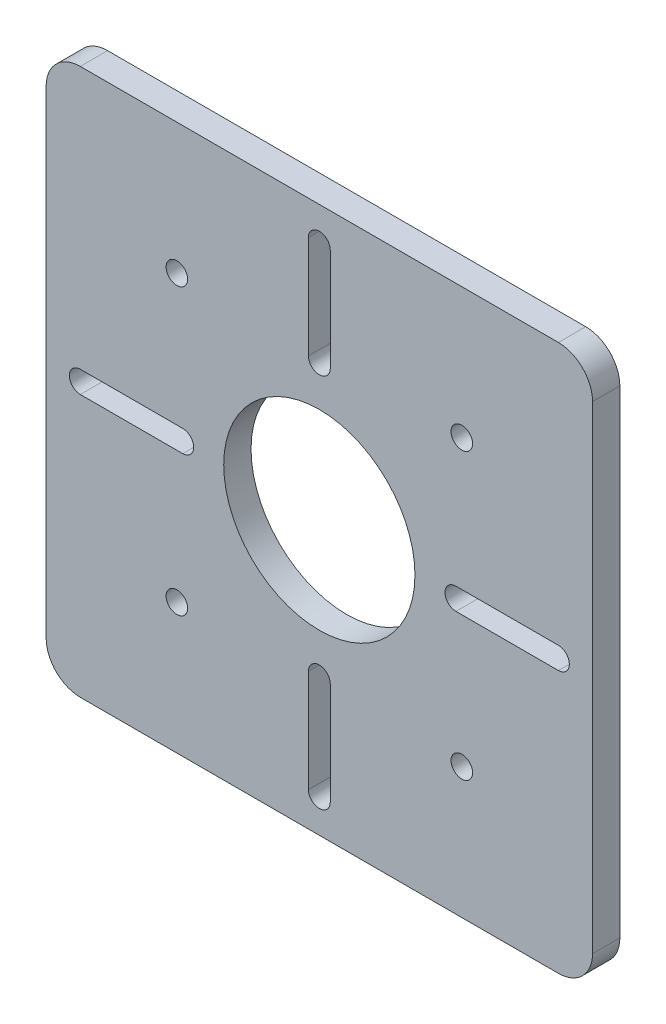
ISO-10303-21;
HEADER;
FILE_DESCRIPTION(('STEP AP214'),'2;1');
FILE_NAME('part.step','',(''),(''),'','','');
FILE_SCHEMA(('AUTOMOTIVE_DESIGN { 1 0 10303 214 1 1 1 1 }'));
ENDSEC;
DATA;
#1=APPLICATION_CONTEXT('core data for automotive mechanical design processes');
#2=APPLICATION_PROTOCOL_DEFINITION('international standard','automotive_design',2000,#1);
#3=PRODUCT_CONTEXT('',#1,'mechanical');
#4=PRODUCT('Part','Part','',(#3));
#5=PRODUCT_RELATED_PRODUCT_CATEGORY('part','',(#4));
#6=PRODUCT_DEFINITION_FORMATION('','',#4);
#7=PRODUCT_DEFINITION_CONTEXT('part definition',#1,'design');
#8=PRODUCT_DEFINITION('design','',#6,#7);
#9=PRODUCT_DEFINITION_SHAPE('','',#8);
#10=(LENGTH_UNIT() NAMED_UNIT(*) SI_UNIT(.MILLI.,.METRE.));
#11=(NAMED_UNIT(*) PLANE_ANGLE_UNIT() SI_UNIT($,.RADIAN.));
#12=(NAMED_UNIT(*) SI_UNIT($,.STERADIAN.) SOLID_ANGLE_UNIT());
#13=UNCERTAINTY_MEASURE_WITH_UNIT(LENGTH_MEASURE(1.E-05),#10,'distance_accuracy_value','');
#14=(GEOMETRIC_REPRESENTATION_CONTEXT(3) GLOBAL_UNCERTAINTY_ASSIGNED_CONTEXT((#13)) GLOBAL_UNIT_ASSIGNED_CONTEXT((#10,
#11,#12)) REPRESENTATION_CONTEXT('',''));
#15=CARTESIAN_POINT('',(0.,0.,0.));
#16=DIRECTION('',(0.,0.,1.));
#17=DIRECTION('',(1.,0.,0.));
#18=AXIS2_PLACEMENT_3D('',#15,#16,#17);
#19=CARTESIAN_POINT('',(0.,0.,4.));
#20=DIRECTION('',(0.,0.,-1.));
#21=DIRECTION('',(-1.,0.,0.));
#22=AXIS2_PLACEMENT_3D('',#19,#20,#21);
#23=PLANE('',#22);
#24=CARTESIAN_POINT('',(0.,0.,4.));
#25=DIRECTION('',(0.,0.,1.));
#26=DIRECTION('',(1.,0.,0.));
#27=AXIS2_PLACEMENT_3D('',#24,#25,#26);
#28=CIRCLE('',#27,14.);
#29=CARTESIAN_POINT('',(14.,0.,4.));
#30=VERTEX_POINT('',#29);
#31=EDGE_CURVE('E249',#30,#30,#28,.T.);
#32=ORIENTED_EDGE('',*,*,#31,.F.);
#33=EDGE_LOOP('',(#32));
#34=FACE_BOUND('',#33,.T.);
#35=CARTESIAN_POINT('',(35.0000000000001,-7.54604712049911E-13,4.));
#36=DIRECTION('',(0.,0.,1.));
#37=DIRECTION('',(1.,0.,0.));
#38=AXIS2_PLACEMENT_3D('',#35,#36,#37);
#39=CIRCLE('',#38,1.59999999999997);
#40=CARTESIAN_POINT('',(35.,-1.60000000000071,4.));
#41=VERTEX_POINT('',#40);
#42=CARTESIAN_POINT('',(35.0000000000001,1.59999999999924,4.));
#43=VERTEX_POINT('',#42);
#44=EDGE_CURVE('E255',#41,#43,#39,.T.);
#45=ORIENTED_EDGE('',*,*,#44,.F.);
#46=DIRECTION('',(1.,0.,0.));
#47=VECTOR('',#46,1.);
#48=CARTESIAN_POINT('',(20.,-1.60000000000042,4.));
#49=LINE('',#48,#47);
#50=CARTESIAN_POINT('',(20.,-1.60000000000042,4.));
#51=VERTEX_POINT('',#50);
#52=EDGE_CURVE('E263',#51,#41,#49,.T.);
#53=ORIENTED_EDGE('',*,*,#52,.F.);
#54=CARTESIAN_POINT('',(20.,-4.40619762898109E-13,4.));
#55=DIRECTION('',(0.,0.,1.));
#56=DIRECTION('',(1.,0.,0.));
#57=AXIS2_PLACEMENT_3D('',#54,#55,#56);
#58=CIRCLE('',#57,1.59999999999997);
#59=CARTESIAN_POINT('',(20.,1.59999999999953,4.));
#60=VERTEX_POINT('',#59);
#61=EDGE_CURVE('E260',#60,#51,#58,.T.);
#62=ORIENTED_EDGE('',*,*,#61,.F.);
#63=DIRECTION('',(-1.,0.,0.));
#64=VECTOR('',#63,1.);
#65=CARTESIAN_POINT('',(35.0000000000001,1.59999999999924,4.));
#66=LINE('',#65,#64);
#67=EDGE_CURVE('E257',#43,#60,#66,.T.);
#68=ORIENTED_EDGE('',*,*,#67,.F.);
#69=EDGE_LOOP('',(#45,#53,#62,#68));
#70=FACE_BOUND('',#69,.T.);
#71=CARTESIAN_POINT('',(6.80011602582908E-13,35.,4.));
#72=DIRECTION('',(0.,0.,1.));
#73=DIRECTION('',(1.,0.,0.));
#74=AXIS2_PLACEMENT_3D('',#71,#72,#73);
#75=CIRCLE('',#74,1.6);
#76=CARTESIAN_POINT('',(1.60000000000068,35.,4.));
#77=VERTEX_POINT('',#76);
#78=CARTESIAN_POINT('',(-1.59999999999932,35.,4.));
#79=VERTEX_POINT('',#78);
#80=EDGE_CURVE('E318',#77,#79,#75,.T.);
#81=ORIENTED_EDGE('',*,*,#80,.F.);
#82=DIRECTION('',(0.,1.,0.));
#83=VECTOR('',#82,1.);
#84=CARTESIAN_POINT('',(1.60000000000041,20.,4.));
#85=LINE('',#84,#83);
#86=CARTESIAN_POINT('',(1.60000000000041,20.,4.));
#87=VERTEX_POINT('',#86);
#88=EDGE_CURVE('E326',#87,#77,#85,.T.);
#89=ORIENTED_EDGE('',*,*,#88,.F.);
#90=CARTESIAN_POINT('',(4.02455846426619E-13,20.,4.));
#91=DIRECTION('',(0.,0.,1.));
#92=DIRECTION('',(1.,0.,0.));
#93=AXIS2_PLACEMENT_3D('',#90,#91,#92);
#94=CIRCLE('',#93,1.6);
#95=CARTESIAN_POINT('',(-1.5999999999996,20.,4.));
#96=VERTEX_POINT('',#95);
#97=EDGE_CURVE('E323',#96,#87,#94,.T.);
#98=ORIENTED_EDGE('',*,*,#97,.F.);
#99=DIRECTION('',(0.,-1.,0.));
#100=VECTOR('',#99,1.);
#101=CARTESIAN_POINT('',(-1.59999999999932,35.,4.));
#102=LINE('',#101,#100);
#103=EDGE_CURVE('E320',#79,#96,#102,.T.);
#104=ORIENTED_EDGE('',*,*,#103,.F.);
#105=EDGE_LOOP('',(#81,#89,#98,#104));
#106=FACE_BOUND('',#105,.T.);
#107=DIRECTION('',(-1.,0.,0.));
#108=VECTOR('',#107,1.);
#109=CARTESIAN_POINT('',(-40.,40.,4.));
#110=LINE('',#109,#108);
#111=CARTESIAN_POINT('',(35.,40.,4.));
#112=VERTEX_POINT('',#111);
#113=CARTESIAN_POINT('',(-35.,40.,4.));
#114=VERTEX_POINT('',#113);
#115=EDGE_CURVE('E350',#112,#114,#110,.T.);
#116=ORIENTED_EDGE('',*,*,#115,.T.);
#117=CARTESIAN_POINT('',(-35.,35.,4.));
#118=DIRECTION('',(0.,0.,-1.));
#119=DIRECTION('',(-1.,0.,0.));
#120=AXIS2_PLACEMENT_3D('',#117,#118,#119);
#121=CIRCLE('',#120,5.);
#122=CARTESIAN_POINT('',(-40.,35.,4.));
#123=VERTEX_POINT('',#122);
#124=EDGE_CURVE('E390',#114,#123,#121,.F.);
#125=ORIENTED_EDGE('',*,*,#124,.T.);
#126=DIRECTION('',(0.,-1.,0.));
#127=VECTOR('',#126,1.);
#128=CARTESIAN_POINT('',(-40.,-40.,4.));
#129=LINE('',#128,#127);
#130=CARTESIAN_POINT('',(-40.,-35.,4.));
#131=VERTEX_POINT('',#130);
#132=EDGE_CURVE('E354',#123,#131,#129,.T.);
#133=ORIENTED_EDGE('',*,*,#132,.T.);
#134=CARTESIAN_POINT('',(-35.,-35.,4.));
#135=DIRECTION('',(0.,0.,-1.));
#136=DIRECTION('',(-1.,0.,0.));
#137=AXIS2_PLACEMENT_3D('',#134,#135,#136);
#138=CIRCLE('',#137,5.);
#139=CARTESIAN_POINT('',(-35.,-40.,4.));
#140=VERTEX_POINT('',#139);
#141=EDGE_CURVE('E63',#131,#140,#138,.F.);
#142=ORIENTED_EDGE('',*,*,#141,.T.);
#143=DIRECTION('',(1.,0.,0.));
#144=VECTOR('',#143,1.);
#145=CARTESIAN_POINT('',(-40.,-40.,4.));
#146=LINE('',#145,#144);
#147=CARTESIAN_POINT('',(35.,-40.,4.));
#148=VERTEX_POINT('',#147);
#149=EDGE_CURVE('E356',#140,#148,#146,.T.);
#150=ORIENTED_EDGE('',*,*,#149,.T.);
#151=CARTESIAN_POINT('',(35.,-35.,4.));
#152=DIRECTION('',(0.,0.,-1.));
#153=DIRECTION('',(-1.,0.,0.));
#154=AXIS2_PLACEMENT_3D('',#151,#152,#153);
#155=CIRCLE('',#154,5.);
#156=CARTESIAN_POINT('',(40.,-35.,4.));
#157=VERTEX_POINT('',#156);
#158=EDGE_CURVE('E386',#148,#157,#155,.F.);
#159=ORIENTED_EDGE('',*,*,#158,.T.);
#160=DIRECTION('',(0.,1.,0.));
#161=VECTOR('',#160,1.);
#162=CARTESIAN_POINT('',(40.,-40.,4.));
#163=LINE('',#162,#161);
#164=CARTESIAN_POINT('',(40.,35.,4.));
#165=VERTEX_POINT('',#164);
#166=EDGE_CURVE('E347',#157,#165,#163,.T.);
#167=ORIENTED_EDGE('',*,*,#166,.T.);
#168=CARTESIAN_POINT('',(35.,35.,4.));
#169=DIRECTION('',(0.,0.,-1.));
#170=DIRECTION('',(-1.,0.,0.));
#171=AXIS2_PLACEMENT_3D('',#168,#169,#170);
#172=CIRCLE('',#171,5.);
#173=EDGE_CURVE('E388',#165,#112,#172,.F.);
#174=ORIENTED_EDGE('',*,*,#173,.T.);
#175=EDGE_LOOP('',(#116,#125,#133,#142,#150,#159,#167,#174));
#176=FACE_BOUND('',#175,.T.);
#177=CARTESIAN_POINT('',(-7.7715611723761E-13,-35.0000000000001,4.));
#178=DIRECTION('',(0.,0.,1.));
#179=DIRECTION('',(1.,0.,0.));
#180=AXIS2_PLACEMENT_3D('',#177,#178,#179);
#181=CIRCLE('',#180,1.6);
#182=CARTESIAN_POINT('',(-1.60000000000078,-35.,4.));
#183=VERTEX_POINT('',#182);
#184=CARTESIAN_POINT('',(1.59999999999923,-35.0000000000001,4.));
#185=VERTEX_POINT('',#184);
#186=EDGE_CURVE('E286',#183,#185,#181,.T.);
#187=ORIENTED_EDGE('',*,*,#186,.F.);
#188=DIRECTION('',(0.,-1.,0.));
#189=VECTOR('',#188,1.);
#190=CARTESIAN_POINT('',(-1.60000000000039,-20.,4.));
#191=LINE('',#190,#189);
#192=CARTESIAN_POINT('',(-1.60000000000039,-20.,4.));
#193=VERTEX_POINT('',#192);
#194=EDGE_CURVE('E294',#193,#183,#191,.T.);
#195=ORIENTED_EDGE('',*,*,#194,.F.);
#196=CARTESIAN_POINT('',(-4.85722573273506E-13,-20.,4.));
#197=DIRECTION('',(0.,0.,1.));
#198=DIRECTION('',(1.,0.,0.));
#199=AXIS2_PLACEMENT_3D('',#196,#197,#198);
#200=CIRCLE('',#199,1.59999999999998);
#201=CARTESIAN_POINT('',(1.59999999999949,-20.0000000000001,4.));
#202=VERTEX_POINT('',#201);
#203=EDGE_CURVE('E291',#202,#193,#200,.T.);
#204=ORIENTED_EDGE('',*,*,#203,.F.);
#205=DIRECTION('',(0.,1.,0.));
#206=VECTOR('',#205,1.);
#207=CARTESIAN_POINT('',(1.59999999999923,-35.0000000000001,4.));
#208=LINE('',#207,#206);
#209=EDGE_CURVE('E288',#185,#202,#208,.T.);
#210=ORIENTED_EDGE('',*,*,#209,.F.);
#211=EDGE_LOOP('',(#187,#195,#204,#210));
#212=FACE_BOUND('',#211,.T.);
#213=CARTESIAN_POINT('',(-19.9999999999999,0.,4.));
#214=DIRECTION('',(0.,0.,1.));
#215=DIRECTION('',(1.,0.,0.));
#216=AXIS2_PLACEMENT_3D('',#213,#214,#215);
#217=CIRCLE('',#216,1.59999999999998);
#218=CARTESIAN_POINT('',(-20.,-1.59999999999999,4.));
#219=VERTEX_POINT('',#218);
#220=CARTESIAN_POINT('',(-19.9999999999999,1.59999999999997,4.));
#221=VERTEX_POINT('',#220);
#222=EDGE_CURVE('E205',#219,#221,#217,.T.);
#223=ORIENTED_EDGE('',*,*,#222,.F.);
#224=DIRECTION('',(1.,0.,0.));
#225=VECTOR('',#224,1.);
#226=CARTESIAN_POINT('',(-35.,-1.59999999999999,4.));
#227=LINE('',#226,#225);
#228=CARTESIAN_POINT('',(-35.,-1.59999999999999,4.));
#229=VERTEX_POINT('',#228);
#230=EDGE_CURVE('E231',#229,#219,#227,.T.);
#231=ORIENTED_EDGE('',*,*,#230,.F.);
#232=CARTESIAN_POINT('',(-35.,0.,4.));
#233=DIRECTION('',(0.,0.,1.));
#234=DIRECTION('',(1.,0.,0.));
#235=AXIS2_PLACEMENT_3D('',#232,#233,#234);
#236=CIRCLE('',#235,1.59999999999998);
#237=CARTESIAN_POINT('',(-35.,1.59999999999997,4.));
#238=VERTEX_POINT('',#237);
#239=EDGE_CURVE('E229',#238,#229,#236,.T.);
#240=ORIENTED_EDGE('',*,*,#239,.F.);
#241=DIRECTION('',(-1.,0.,0.));
#242=VECTOR('',#241,1.);
#243=CARTESIAN_POINT('',(-19.9999999999999,1.59999999999997,4.));
#244=LINE('',#243,#242);
#245=EDGE_CURVE('E215',#221,#238,#244,.T.);
#246=ORIENTED_EDGE('',*,*,#245,.F.);
#247=EDGE_LOOP('',(#223,#231,#240,#246));
#248=FACE_BOUND('',#247,.T.);
#249=CARTESIAN_POINT('',(-20.8596500450031,-20.8596500450031,4.));
#250=DIRECTION('',(0.,0.,1.));
#251=DIRECTION('',(1.,0.,0.));
#252=AXIS2_PLACEMENT_3D('',#249,#250,#251);
#253=CIRCLE('',#252,1.575);
#254=CARTESIAN_POINT('',(-19.2846500450032,-20.8596500450031,4.));
#255=VERTEX_POINT('',#254);
#256=EDGE_CURVE('E238',#255,#255,#253,.T.);
#257=ORIENTED_EDGE('',*,*,#256,.F.);
#258=EDGE_LOOP('',(#257));
#259=FACE_BOUND('',#258,.T.);
#260=CARTESIAN_POINT('',(-20.8596500450031,20.8596500450032,4.));
#261=DIRECTION('',(0.,0.,1.));
#262=DIRECTION('',(1.,0.,0.));
#263=AXIS2_PLACEMENT_3D('',#260,#261,#262);
#264=CIRCLE('',#263,1.575);
#265=CARTESIAN_POINT('',(-19.2846500450031,20.8596500450032,4.));
#266=VERTEX_POINT('',#265);
#267=EDGE_CURVE('E785',#266,#266,#264,.T.);
#268=ORIENTED_EDGE('',*,*,#267,.F.);
#269=EDGE_LOOP('',(#268));
#270=FACE_BOUND('',#269,.T.);
#271=CARTESIAN_POINT('',(20.8596500450033,20.859650045003,4.));
#272=DIRECTION('',(0.,0.,1.));
#273=DIRECTION('',(1.,0.,0.));
#274=AXIS2_PLACEMENT_3D('',#271,#272,#273);
#275=CIRCLE('',#274,1.575);
#276=CARTESIAN_POINT('',(22.4346500450033,20.859650045003,4.));
#277=VERTEX_POINT('',#276);
#278=EDGE_CURVE('E780',#277,#277,#275,.T.);
#279=ORIENTED_EDGE('',*,*,#278,.F.);
#280=EDGE_LOOP('',(#279));
#281=FACE_BOUND('',#280,.T.);
#282=CARTESIAN_POINT('',(20.8596500450029,-20.8596500450034,4.));
#283=DIRECTION('',(0.,0.,1.));
#284=DIRECTION('',(1.,0.,0.));
#285=AXIS2_PLACEMENT_3D('',#282,#283,#284);
#286=CIRCLE('',#285,1.575);
#287=CARTESIAN_POINT('',(22.4346500450029,-20.8596500450034,4.));
#288=VERTEX_POINT('',#287);
#289=EDGE_CURVE('E774',#288,#288,#286,.T.);
#290=ORIENTED_EDGE('',*,*,#289,.F.);
#291=EDGE_LOOP('',(#290));
#292=FACE_BOUND('',#291,.T.);
#293=ADVANCED_FACE('F43',(#34,#70,#106,#176,#212,#248,#259,#270,#281,#292),#23,.F.);
#294=CARTESIAN_POINT('',(0.,0.,0.));
#295=DIRECTION('',(0.,0.,-1.));
#296=DIRECTION('',(-1.,0.,0.));
#297=AXIS2_PLACEMENT_3D('',#294,#295,#296);
#298=PLANE('',#297);
#299=CARTESIAN_POINT('',(20.8596500450033,20.859650045003,0.));
#300=DIRECTION('',(0.,0.,1.));
#301=DIRECTION('',(1.,0.,0.));
#302=AXIS2_PLACEMENT_3D('',#299,#300,#301);
#303=CIRCLE('',#302,1.575);
#304=CARTESIAN_POINT('',(22.4346500450033,20.859650045003,0.));
#305=VERTEX_POINT('',#304);
#306=EDGE_CURVE('E777',#305,#305,#303,.T.);
#307=ORIENTED_EDGE('',*,*,#306,.T.);
#308=EDGE_LOOP('',(#307));
#309=FACE_BOUND('',#308,.T.);
#310=CARTESIAN_POINT('',(-20.8596500450031,-20.8596500450031,0.));
#311=DIRECTION('',(0.,0.,1.));
#312=DIRECTION('',(1.,0.,0.));
#313=AXIS2_PLACEMENT_3D('',#310,#311,#312);
#314=CIRCLE('',#313,1.575);
#315=CARTESIAN_POINT('',(-19.2846500450032,-20.8596500450031,0.));
#316=VERTEX_POINT('',#315);
#317=EDGE_CURVE('E788',#316,#316,#314,.T.);
#318=ORIENTED_EDGE('',*,*,#317,.T.);
#319=EDGE_LOOP('',(#318));
#320=FACE_BOUND('',#319,.T.);
#321=DIRECTION('',(1.,0.,0.));
#322=VECTOR('',#321,1.);
#323=CARTESIAN_POINT('',(20.,-1.60000000000042,0.));
#324=LINE('',#323,#322);
#325=CARTESIAN_POINT('',(20.,-1.60000000000042,0.));
#326=VERTEX_POINT('',#325);
#327=CARTESIAN_POINT('',(35.,-1.60000000000071,0.));
#328=VERTEX_POINT('',#327);
#329=EDGE_CURVE('E258',#326,#328,#324,.T.);
#330=ORIENTED_EDGE('',*,*,#329,.T.);
#331=CARTESIAN_POINT('',(35.0000000000001,-7.54604712049911E-13,0.));
#332=DIRECTION('',(0.,0.,1.));
#333=DIRECTION('',(1.,0.,0.));
#334=AXIS2_PLACEMENT_3D('',#331,#332,#333);
#335=CIRCLE('',#334,1.59999999999997);
#336=CARTESIAN_POINT('',(35.0000000000001,1.59999999999924,0.));
#337=VERTEX_POINT('',#336);
#338=EDGE_CURVE('E252',#328,#337,#335,.T.);
#339=ORIENTED_EDGE('',*,*,#338,.T.);
#340=DIRECTION('',(-1.,0.,0.));
#341=VECTOR('',#340,1.);
#342=CARTESIAN_POINT('',(35.0000000000001,1.59999999999924,0.));
#343=LINE('',#342,#341);
#344=CARTESIAN_POINT('',(20.,1.59999999999953,0.));
#345=VERTEX_POINT('',#344);
#346=EDGE_CURVE('E268',#337,#345,#343,.T.);
#347=ORIENTED_EDGE('',*,*,#346,.T.);
#348=CARTESIAN_POINT('',(20.,-4.40619762898109E-13,0.));
#349=DIRECTION('',(0.,0.,1.));
#350=DIRECTION('',(1.,0.,0.));
#351=AXIS2_PLACEMENT_3D('',#348,#349,#350);
#352=CIRCLE('',#351,1.59999999999997);
#353=EDGE_CURVE('E271',#345,#326,#352,.T.);
#354=ORIENTED_EDGE('',*,*,#353,.T.);
#355=EDGE_LOOP('',(#330,#339,#347,#354));
#356=FACE_BOUND('',#355,.T.);
#357=DIRECTION('',(0.,-1.,0.));
#358=VECTOR('',#357,1.);
#359=CARTESIAN_POINT('',(-1.60000000000039,-20.,0.));
#360=LINE('',#359,#358);
#361=CARTESIAN_POINT('',(-1.60000000000039,-20.,0.));
#362=VERTEX_POINT('',#361);
#363=CARTESIAN_POINT('',(-1.60000000000078,-35.,0.));
#364=VERTEX_POINT('',#363);
#365=EDGE_CURVE('E289',#362,#364,#360,.T.);
#366=ORIENTED_EDGE('',*,*,#365,.T.);
#367=CARTESIAN_POINT('',(-7.7715611723761E-13,-35.0000000000001,0.));
#368=DIRECTION('',(0.,0.,1.));
#369=DIRECTION('',(1.,0.,0.));
#370=AXIS2_PLACEMENT_3D('',#367,#368,#369);
#371=CIRCLE('',#370,1.6);
#372=CARTESIAN_POINT('',(1.59999999999923,-35.0000000000001,0.));
#373=VERTEX_POINT('',#372);
#374=EDGE_CURVE('E285',#364,#373,#371,.T.);
#375=ORIENTED_EDGE('',*,*,#374,.T.);
#376=DIRECTION('',(0.,1.,0.));
#377=VECTOR('',#376,1.);
#378=CARTESIAN_POINT('',(1.59999999999923,-35.0000000000001,0.));
#379=LINE('',#378,#377);
#380=CARTESIAN_POINT('',(1.59999999999949,-20.0000000000001,0.));
#381=VERTEX_POINT('',#380);
#382=EDGE_CURVE('E299',#373,#381,#379,.T.);
#383=ORIENTED_EDGE('',*,*,#382,.T.);
#384=CARTESIAN_POINT('',(-4.85722573273506E-13,-20.,0.));
#385=DIRECTION('',(0.,0.,1.));
#386=DIRECTION('',(1.,0.,0.));
#387=AXIS2_PLACEMENT_3D('',#384,#385,#386);
#388=CIRCLE('',#387,1.59999999999993);
#389=EDGE_CURVE('E302',#381,#362,#388,.T.);
#390=ORIENTED_EDGE('',*,*,#389,.T.);
#391=EDGE_LOOP('',(#366,#375,#383,#390));
#392=FACE_BOUND('',#391,.T.);
#393=DIRECTION('',(0.,1.,0.));
#394=VECTOR('',#393,1.);
#395=CARTESIAN_POINT('',(1.60000000000041,20.,0.));
#396=LINE('',#395,#394);
#397=CARTESIAN_POINT('',(1.60000000000041,20.,0.));
#398=VERTEX_POINT('',#397);
#399=CARTESIAN_POINT('',(1.60000000000068,35.,0.));
#400=VERTEX_POINT('',#399);
#401=EDGE_CURVE('E321',#398,#400,#396,.T.);
#402=ORIENTED_EDGE('',*,*,#401,.T.);
#403=CARTESIAN_POINT('',(6.80011602582908E-13,35.,0.));
#404=DIRECTION('',(0.,0.,1.));
#405=DIRECTION('',(1.,0.,0.));
#406=AXIS2_PLACEMENT_3D('',#403,#404,#405);
#407=CIRCLE('',#406,1.6);
#408=CARTESIAN_POINT('',(-1.59999999999932,35.,0.));
#409=VERTEX_POINT('',#408);
#410=EDGE_CURVE('E317',#400,#409,#407,.T.);
#411=ORIENTED_EDGE('',*,*,#410,.T.);
#412=DIRECTION('',(0.,-1.,0.));
#413=VECTOR('',#412,1.);
#414=CARTESIAN_POINT('',(-1.59999999999932,35.,0.));
#415=LINE('',#414,#413);
#416=CARTESIAN_POINT('',(-1.5999999999996,20.,0.));
#417=VERTEX_POINT('',#416);
#418=EDGE_CURVE('E331',#409,#417,#415,.T.);
#419=ORIENTED_EDGE('',*,*,#418,.T.);
#420=CARTESIAN_POINT('',(4.02455846426619E-13,20.,0.));
#421=DIRECTION('',(0.,0.,1.));
#422=DIRECTION('',(1.,0.,0.));
#423=AXIS2_PLACEMENT_3D('',#420,#421,#422);
#424=CIRCLE('',#423,1.6);
#425=EDGE_CURVE('E334',#417,#398,#424,.T.);
#426=ORIENTED_EDGE('',*,*,#425,.T.);
#427=EDGE_LOOP('',(#402,#411,#419,#426));
#428=FACE_BOUND('',#427,.T.);
#429=DIRECTION('',(0.,-1.,0.));
#430=VECTOR('',#429,1.);
#431=CARTESIAN_POINT('',(-40.,-40.,0.));
#432=LINE('',#431,#430);
#433=CARTESIAN_POINT('',(-40.,35.,0.));
#434=VERTEX_POINT('',#433);
#435=CARTESIAN_POINT('',(-40.,-35.,0.));
#436=VERTEX_POINT('',#435);
#437=EDGE_CURVE('E364',#434,#436,#432,.T.);
#438=ORIENTED_EDGE('',*,*,#437,.F.);
#439=CARTESIAN_POINT('',(-35.,35.,0.));
#440=DIRECTION('',(0.,0.,-1.));
#441=DIRECTION('',(-1.,0.,0.));
#442=AXIS2_PLACEMENT_3D('',#439,#440,#441);
#443=CIRCLE('',#442,5.);
#444=CARTESIAN_POINT('',(-35.,40.,0.));
#445=VERTEX_POINT('',#444);
#446=EDGE_CURVE('E378',#434,#445,#443,.T.);
#447=ORIENTED_EDGE('',*,*,#446,.T.);
#448=DIRECTION('',(-1.,0.,0.));
#449=VECTOR('',#448,1.);
#450=CARTESIAN_POINT('',(-40.,40.,0.));
#451=LINE('',#450,#449);
#452=CARTESIAN_POINT('',(35.,40.,0.));
#453=VERTEX_POINT('',#452);
#454=EDGE_CURVE('E361',#453,#445,#451,.T.);
#455=ORIENTED_EDGE('',*,*,#454,.F.);
#456=CARTESIAN_POINT('',(35.,35.,0.));
#457=DIRECTION('',(0.,0.,-1.));
#458=DIRECTION('',(-1.,0.,0.));
#459=AXIS2_PLACEMENT_3D('',#456,#457,#458);
#460=CIRCLE('',#459,5.);
#461=CARTESIAN_POINT('',(40.,35.,0.));
#462=VERTEX_POINT('',#461);
#463=EDGE_CURVE('E376',#453,#462,#460,.T.);
#464=ORIENTED_EDGE('',*,*,#463,.T.);
#465=DIRECTION('',(0.,1.,0.));
#466=VECTOR('',#465,1.);
#467=CARTESIAN_POINT('',(40.,-40.,0.));
#468=LINE('',#467,#466);
#469=CARTESIAN_POINT('',(40.,-35.,0.));
#470=VERTEX_POINT('',#469);
#471=EDGE_CURVE('E346',#470,#462,#468,.T.);
#472=ORIENTED_EDGE('',*,*,#471,.F.);
#473=CARTESIAN_POINT('',(35.,-35.,0.));
#474=DIRECTION('',(0.,0.,-1.));
#475=DIRECTION('',(-1.,0.,0.));
#476=AXIS2_PLACEMENT_3D('',#473,#474,#475);
#477=CIRCLE('',#476,5.);
#478=CARTESIAN_POINT('',(35.,-40.,0.));
#479=VERTEX_POINT('',#478);
#480=EDGE_CURVE('E374',#470,#479,#477,.T.);
#481=ORIENTED_EDGE('',*,*,#480,.T.);
#482=DIRECTION('',(1.,0.,0.));
#483=VECTOR('',#482,1.);
#484=CARTESIAN_POINT('',(-40.,-40.,0.));
#485=LINE('',#484,#483);
#486=CARTESIAN_POINT('',(-35.,-40.,0.));
#487=VERTEX_POINT('',#486);
#488=EDGE_CURVE('E351',#487,#479,#485,.T.);
#489=ORIENTED_EDGE('',*,*,#488,.F.);
#490=CARTESIAN_POINT('',(-35.,-35.,0.));
#491=DIRECTION('',(0.,0.,-1.));
#492=DIRECTION('',(-1.,0.,0.));
#493=AXIS2_PLACEMENT_3D('',#490,#491,#492);
#494=CIRCLE('',#493,5.);
#495=EDGE_CURVE('E372',#487,#436,#494,.T.);
#496=ORIENTED_EDGE('',*,*,#495,.T.);
#497=EDGE_LOOP('',(#438,#447,#455,#464,#472,#481,#489,#496));
#498=FACE_BOUND('',#497,.T.);
#499=CARTESIAN_POINT('',(0.,0.,0.));
#500=DIRECTION('',(0.,0.,1.));
#501=DIRECTION('',(1.,0.,0.));
#502=AXIS2_PLACEMENT_3D('',#499,#500,#501);
#503=CIRCLE('',#502,14.);
#504=CARTESIAN_POINT('',(14.,0.,0.));
#505=VERTEX_POINT('',#504);
#506=EDGE_CURVE('E223',#505,#505,#503,.T.);
#507=ORIENTED_EDGE('',*,*,#506,.T.);
#508=EDGE_LOOP('',(#507));
#509=FACE_BOUND('',#508,.T.);
#510=DIRECTION('',(1.,0.,0.));
#511=VECTOR('',#510,1.);
#512=CARTESIAN_POINT('',(-35.,-1.59999999999999,0.));
#513=LINE('',#512,#511);
#514=CARTESIAN_POINT('',(-35.,-1.59999999999999,0.));
#515=VERTEX_POINT('',#514);
#516=CARTESIAN_POINT('',(-20.,-1.59999999999999,0.));
#517=VERTEX_POINT('',#516);
#518=EDGE_CURVE('E216',#515,#517,#513,.T.);
#519=ORIENTED_EDGE('',*,*,#518,.T.);
#520=CARTESIAN_POINT('',(-19.9999999999999,0.,0.));
#521=DIRECTION('',(0.,0.,1.));
#522=DIRECTION('',(1.,0.,0.));
#523=AXIS2_PLACEMENT_3D('',#520,#521,#522);
#524=CIRCLE('',#523,1.59999999999998);
#525=CARTESIAN_POINT('',(-19.9999999999999,1.59999999999997,0.));
#526=VERTEX_POINT('',#525);
#527=EDGE_CURVE('E236',#517,#526,#524,.T.);
#528=ORIENTED_EDGE('',*,*,#527,.T.);
#529=DIRECTION('',(-1.,0.,0.));
#530=VECTOR('',#529,1.);
#531=CARTESIAN_POINT('',(-19.9999999999999,1.59999999999997,0.));
#532=LINE('',#531,#530);
#533=CARTESIAN_POINT('',(-35.,1.59999999999997,0.));
#534=VERTEX_POINT('',#533);
#535=EDGE_CURVE('E222',#526,#534,#532,.T.);
#536=ORIENTED_EDGE('',*,*,#535,.T.);
#537=CARTESIAN_POINT('',(-35.,0.,0.));
#538=DIRECTION('',(0.,0.,1.));
#539=DIRECTION('',(1.,0.,0.));
#540=AXIS2_PLACEMENT_3D('',#537,#538,#539);
#541=CIRCLE('',#540,1.59999999999998);
#542=EDGE_CURVE('E240',#534,#515,#541,.T.);
#543=ORIENTED_EDGE('',*,*,#542,.T.);
#544=EDGE_LOOP('',(#519,#528,#536,#543));
#545=FACE_BOUND('',#544,.T.);
#546=CARTESIAN_POINT('',(-20.8596500450031,20.8596500450032,0.));
#547=DIRECTION('',(0.,0.,1.));
#548=DIRECTION('',(1.,0.,0.));
#549=AXIS2_PLACEMENT_3D('',#546,#547,#548);
#550=CIRCLE('',#549,1.575);
#551=CARTESIAN_POINT('',(-19.2846500450031,20.8596500450032,0.));
#552=VERTEX_POINT('',#551);
#553=EDGE_CURVE('E769',#552,#552,#550,.T.);
#554=ORIENTED_EDGE('',*,*,#553,.T.);
#555=EDGE_LOOP('',(#554));
#556=FACE_BOUND('',#555,.T.);
#557=CARTESIAN_POINT('',(20.8596500450029,-20.8596500450034,0.));
#558=DIRECTION('',(0.,0.,1.));
#559=DIRECTION('',(1.,0.,0.));
#560=AXIS2_PLACEMENT_3D('',#557,#558,#559);
#561=CIRCLE('',#560,1.575);
#562=CARTESIAN_POINT('',(22.4346500450029,-20.8596500450034,0.));
#563=VERTEX_POINT('',#562);
#564=EDGE_CURVE('E772',#563,#563,#561,.T.);
#565=ORIENTED_EDGE('',*,*,#564,.T.);
#566=EDGE_LOOP('',(#565));
#567=FACE_BOUND('',#566,.T.);
#568=ADVANCED_FACE('F403',(#309,#320,#356,#392,#428,#498,#509,#545,#556,#567),#298,.T.);
#569=CARTESIAN_POINT('',(40.,-40.,4.));
#570=DIRECTION('',(-1.,0.,0.));
#571=DIRECTION('',(0.,0.,1.));
#572=AXIS2_PLACEMENT_3D('',#569,#570,#571);
#573=PLANE('',#572);
#574=ORIENTED_EDGE('',*,*,#471,.T.);
#575=DIRECTION('',(0.,0.,-1.));
#576=VECTOR('',#575,1.);
#577=CARTESIAN_POINT('',(40.,35.,4.));
#578=LINE('',#577,#576);
#579=EDGE_CURVE('E395',#462,#165,#578,.F.);
#580=ORIENTED_EDGE('',*,*,#579,.T.);
#581=ORIENTED_EDGE('',*,*,#166,.F.);
#582=DIRECTION('',(0.,0.,-1.));
#583=VECTOR('',#582,1.);
#584=CARTESIAN_POINT('',(40.,-35.,4.));
#585=LINE('',#584,#583);
#586=EDGE_CURVE('E392',#157,#470,#585,.T.);
#587=ORIENTED_EDGE('',*,*,#586,.T.);
#588=EDGE_LOOP('',(#574,#580,#581,#587));
#589=FACE_BOUND('',#588,.T.);
#590=ADVANCED_FACE('F412',(#589),#573,.F.);
#591=CARTESIAN_POINT('',(-40.,40.,4.));
#592=DIRECTION('',(0.,-1.,0.));
#593=DIRECTION('',(0.,0.,-1.));
#594=AXIS2_PLACEMENT_3D('',#591,#592,#593);
#595=PLANE('',#594);
#596=ORIENTED_EDGE('',*,*,#454,.T.);
#597=DIRECTION('',(0.,0.,-1.));
#598=VECTOR('',#597,1.);
#599=CARTESIAN_POINT('',(-35.,40.,4.));
#600=LINE('',#599,#598);
#601=EDGE_CURVE('E383',#445,#114,#600,.F.);
#602=ORIENTED_EDGE('',*,*,#601,.T.);
#603=ORIENTED_EDGE('',*,*,#115,.F.);
#604=DIRECTION('',(0.,0.,-1.));
#605=VECTOR('',#604,1.);
#606=CARTESIAN_POINT('',(35.,40.,4.));
#607=LINE('',#606,#605);
#608=EDGE_CURVE('E380',#112,#453,#607,.T.);
#609=ORIENTED_EDGE('',*,*,#608,.T.);
#610=EDGE_LOOP('',(#596,#602,#603,#609));
#611=FACE_BOUND('',#610,.T.);
#612=ADVANCED_FACE('F422',(#611),#595,.F.);
#613=CARTESIAN_POINT('',(-40.,-40.,4.));
#614=DIRECTION('',(1.,0.,0.));
#615=DIRECTION('',(0.,0.,-1.));
#616=AXIS2_PLACEMENT_3D('',#613,#614,#615);
#617=PLANE('',#616);
#618=ORIENTED_EDGE('',*,*,#132,.F.);
#619=DIRECTION('',(0.,0.,-1.));
#620=VECTOR('',#619,1.);
#621=CARTESIAN_POINT('',(-40.,35.,4.));
#622=LINE('',#621,#620);
#623=EDGE_CURVE('E369',#123,#434,#622,.T.);
#624=ORIENTED_EDGE('',*,*,#623,.T.);
#625=ORIENTED_EDGE('',*,*,#437,.T.);
#626=DIRECTION('',(0.,0.,-1.));
#627=VECTOR('',#626,1.);
#628=CARTESIAN_POINT('',(-40.,-35.,4.));
#629=LINE('',#628,#627);
#630=EDGE_CURVE('E358',#436,#131,#629,.F.);
#631=ORIENTED_EDGE('',*,*,#630,.T.);
#632=EDGE_LOOP('',(#618,#624,#625,#631));
#633=FACE_BOUND('',#632,.T.);
#634=ADVANCED_FACE('F430',(#633),#617,.F.);
#635=CARTESIAN_POINT('',(-40.,-40.,4.));
#636=DIRECTION('',(0.,1.,0.));
#637=DIRECTION('',(0.,0.,1.));
#638=AXIS2_PLACEMENT_3D('',#635,#636,#637);
#639=PLANE('',#638);
#640=ORIENTED_EDGE('',*,*,#488,.T.);
#641=DIRECTION('',(0.,0.,-1.));
#642=VECTOR('',#641,1.);
#643=CARTESIAN_POINT('',(35.,-40.,4.));
#644=LINE('',#643,#642);
#645=EDGE_CURVE('E11',#479,#148,#644,.F.);
#646=ORIENTED_EDGE('',*,*,#645,.T.);
#647=ORIENTED_EDGE('',*,*,#149,.F.);
#648=DIRECTION('',(0.,0.,-1.));
#649=VECTOR('',#648,1.);
#650=CARTESIAN_POINT('',(-35.,-40.,4.));
#651=LINE('',#650,#649);
#652=EDGE_CURVE('E51',#140,#487,#651,.T.);
#653=ORIENTED_EDGE('',*,*,#652,.T.);
#654=EDGE_LOOP('',(#640,#646,#647,#653));
#655=FACE_BOUND('',#654,.T.);
#656=ADVANCED_FACE('F399',(#655),#639,.F.);
#657=CARTESIAN_POINT('',(6.80011602582908E-13,35.,4.));
#658=DIRECTION('',(0.,0.,-1.));
#659=DIRECTION('',(-1.,0.,0.));
#660=AXIS2_PLACEMENT_3D('',#657,#658,#659);
#661=CYLINDRICAL_SURFACE('',#660,1.6);
#662=ORIENTED_EDGE('',*,*,#410,.F.);
#663=DIRECTION('',(0.,0.,-1.));
#664=VECTOR('',#663,1.);
#665=CARTESIAN_POINT('',(1.60000000000068,35.,4.));
#666=LINE('',#665,#664);
#667=EDGE_CURVE('E328',#77,#400,#666,.T.);
#668=ORIENTED_EDGE('',*,*,#667,.F.);
#669=ORIENTED_EDGE('',*,*,#80,.T.);
#670=DIRECTION('',(0.,0.,-1.));
#671=VECTOR('',#670,1.);
#672=CARTESIAN_POINT('',(-1.59999999999932,35.,4.));
#673=LINE('',#672,#671);
#674=EDGE_CURVE('E344',#79,#409,#673,.T.);
#675=ORIENTED_EDGE('',*,*,#674,.T.);
#676=EDGE_LOOP('',(#662,#668,#669,#675));
#677=FACE_BOUND('',#676,.T.);
#678=ADVANCED_FACE('F448',(#677),#661,.F.);
#679=CARTESIAN_POINT('',(-1.59999999999932,35.,4.));
#680=DIRECTION('',(1.,0.,0.));
#681=DIRECTION('',(0.,1.,0.));
#682=AXIS2_PLACEMENT_3D('',#679,#680,#681);
#683=PLANE('',#682);
#684=ORIENTED_EDGE('',*,*,#418,.F.);
#685=ORIENTED_EDGE('',*,*,#674,.F.);
#686=ORIENTED_EDGE('',*,*,#103,.T.);
#687=DIRECTION('',(0.,0.,-1.));
#688=VECTOR('',#687,1.);
#689=CARTESIAN_POINT('',(-1.5999999999996,20.,4.));
#690=LINE('',#689,#688);
#691=EDGE_CURVE('E342',#96,#417,#690,.T.);
#692=ORIENTED_EDGE('',*,*,#691,.T.);
#693=EDGE_LOOP('',(#684,#685,#686,#692));
#694=FACE_BOUND('',#693,.T.);
#695=ADVANCED_FACE('F649',(#694),#683,.T.);
#696=CARTESIAN_POINT('',(4.02455846426619E-13,20.,4.));
#697=DIRECTION('',(0.,0.,-1.));
#698=DIRECTION('',(-1.,0.,0.));
#699=AXIS2_PLACEMENT_3D('',#696,#697,#698);
#700=CYLINDRICAL_SURFACE('',#699,1.6);
#701=ORIENTED_EDGE('',*,*,#425,.F.);
#702=ORIENTED_EDGE('',*,*,#691,.F.);
#703=ORIENTED_EDGE('',*,*,#97,.T.);
#704=DIRECTION('',(0.,0.,-1.));
#705=VECTOR('',#704,1.);
#706=CARTESIAN_POINT('',(1.60000000000041,20.,4.));
#707=LINE('',#706,#705);
#708=EDGE_CURVE('E340',#87,#398,#707,.T.);
#709=ORIENTED_EDGE('',*,*,#708,.T.);
#710=EDGE_LOOP('',(#701,#702,#703,#709));
#711=FACE_BOUND('',#710,.T.);
#712=ADVANCED_FACE('F640',(#711),#700,.F.);
#713=CARTESIAN_POINT('',(1.60000000000041,20.,4.));
#714=DIRECTION('',(-1.,0.,0.));
#715=DIRECTION('',(0.,-1.,0.));
#716=AXIS2_PLACEMENT_3D('',#713,#714,#715);
#717=PLANE('',#716);
#718=ORIENTED_EDGE('',*,*,#401,.F.);
#719=ORIENTED_EDGE('',*,*,#708,.F.);
#720=ORIENTED_EDGE('',*,*,#88,.T.);
#721=ORIENTED_EDGE('',*,*,#667,.T.);
#722=EDGE_LOOP('',(#718,#719,#720,#721));
#723=FACE_BOUND('',#722,.T.);
#724=ADVANCED_FACE('F631',(#723),#717,.T.);
#725=CARTESIAN_POINT('',(-7.7715611723761E-13,-35.0000000000001,4.));
#726=DIRECTION('',(0.,0.,-1.));
#727=DIRECTION('',(-1.,0.,0.));
#728=AXIS2_PLACEMENT_3D('',#725,#726,#727);
#729=CYLINDRICAL_SURFACE('',#728,1.6);
#730=ORIENTED_EDGE('',*,*,#374,.F.);
#731=DIRECTION('',(0.,0.,-1.));
#732=VECTOR('',#731,1.);
#733=CARTESIAN_POINT('',(-1.60000000000078,-35.,4.));
#734=LINE('',#733,#732);
#735=EDGE_CURVE('E296',#183,#364,#734,.T.);
#736=ORIENTED_EDGE('',*,*,#735,.F.);
#737=ORIENTED_EDGE('',*,*,#186,.T.);
#738=DIRECTION('',(0.,0.,-1.));
#739=VECTOR('',#738,1.);
#740=CARTESIAN_POINT('',(1.59999999999923,-35.0000000000001,4.));
#741=LINE('',#740,#739);
#742=EDGE_CURVE('E314',#185,#373,#741,.T.);
#743=ORIENTED_EDGE('',*,*,#742,.T.);
#744=EDGE_LOOP('',(#730,#736,#737,#743));
#745=FACE_BOUND('',#744,.T.);
#746=ADVANCED_FACE('F622',(#745),#729,.F.);
#747=CARTESIAN_POINT('',(1.59999999999923,-35.0000000000001,4.));
#748=DIRECTION('',(-1.,0.,0.));
#749=DIRECTION('',(0.,-1.,0.));
#750=AXIS2_PLACEMENT_3D('',#747,#748,#749);
#751=PLANE('',#750);
#752=ORIENTED_EDGE('',*,*,#382,.F.);
#753=ORIENTED_EDGE('',*,*,#742,.F.);
#754=ORIENTED_EDGE('',*,*,#209,.T.);
#755=DIRECTION('',(0.,0.,-1.));
#756=VECTOR('',#755,1.);
#757=CARTESIAN_POINT('',(1.59999999999949,-20.0000000000001,4.));
#758=LINE('',#757,#756);
#759=EDGE_CURVE('E311',#202,#381,#758,.T.);
#760=ORIENTED_EDGE('',*,*,#759,.T.);
#761=EDGE_LOOP('',(#752,#753,#754,#760));
#762=FACE_BOUND('',#761,.T.);
#763=ADVANCED_FACE('F613',(#762),#751,.T.);
#764=CARTESIAN_POINT('',(-4.85722573273506E-13,-20.,4.));
#765=DIRECTION('',(0.,0.,-1.));
#766=DIRECTION('',(-1.,0.,0.));
#767=AXIS2_PLACEMENT_3D('',#764,#765,#766);
#768=CYLINDRICAL_SURFACE('',#767,1.59999999999993);
#769=ORIENTED_EDGE('',*,*,#389,.F.);
#770=ORIENTED_EDGE('',*,*,#759,.F.);
#771=ORIENTED_EDGE('',*,*,#203,.T.);
#772=DIRECTION('',(0.,0.,-1.));
#773=VECTOR('',#772,1.);
#774=CARTESIAN_POINT('',(-1.60000000000039,-20.,4.));
#775=LINE('',#774,#773);
#776=EDGE_CURVE('E309',#193,#362,#775,.T.);
#777=ORIENTED_EDGE('',*,*,#776,.T.);
#778=EDGE_LOOP('',(#769,#770,#771,#777));
#779=FACE_BOUND('',#778,.T.);
#780=ADVANCED_FACE('F603',(#779),#768,.F.);
#781=CARTESIAN_POINT('',(-1.60000000000039,-20.,4.));
#782=DIRECTION('',(1.,0.,0.));
#783=DIRECTION('',(0.,1.,0.));
#784=AXIS2_PLACEMENT_3D('',#781,#782,#783);
#785=PLANE('',#784);
#786=ORIENTED_EDGE('',*,*,#365,.F.);
#787=ORIENTED_EDGE('',*,*,#776,.F.);
#788=ORIENTED_EDGE('',*,*,#194,.T.);
#789=ORIENTED_EDGE('',*,*,#735,.T.);
#790=EDGE_LOOP('',(#786,#787,#788,#789));
#791=FACE_BOUND('',#790,.T.);
#792=ADVANCED_FACE('F594',(#791),#785,.T.);
#793=CARTESIAN_POINT('',(35.0000000000001,-7.54604712049911E-13,4.));
#794=DIRECTION('',(0.,0.,-1.));
#795=DIRECTION('',(-1.,0.,0.));
#796=AXIS2_PLACEMENT_3D('',#793,#794,#795);
#797=CYLINDRICAL_SURFACE('',#796,1.59999999999997);
#798=ORIENTED_EDGE('',*,*,#338,.F.);
#799=DIRECTION('',(0.,0.,-1.));
#800=VECTOR('',#799,1.);
#801=CARTESIAN_POINT('',(35.,-1.60000000000071,4.));
#802=LINE('',#801,#800);
#803=EDGE_CURVE('E265',#41,#328,#802,.T.);
#804=ORIENTED_EDGE('',*,*,#803,.F.);
#805=ORIENTED_EDGE('',*,*,#44,.T.);
#806=DIRECTION('',(0.,0.,-1.));
#807=VECTOR('',#806,1.);
#808=CARTESIAN_POINT('',(35.0000000000001,1.59999999999924,4.));
#809=LINE('',#808,#807);
#810=EDGE_CURVE('E282',#43,#337,#809,.T.);
#811=ORIENTED_EDGE('',*,*,#810,.T.);
#812=EDGE_LOOP('',(#798,#804,#805,#811));
#813=FACE_BOUND('',#812,.T.);
#814=ADVANCED_FACE('F585',(#813),#797,.F.);
#815=CARTESIAN_POINT('',(35.0000000000001,1.59999999999924,4.));
#816=DIRECTION('',(0.,-1.,0.));
#817=DIRECTION('',(1.,0.,0.));
#818=AXIS2_PLACEMENT_3D('',#815,#816,#817);
#819=PLANE('',#818);
#820=ORIENTED_EDGE('',*,*,#346,.F.);
#821=ORIENTED_EDGE('',*,*,#810,.F.);
#822=ORIENTED_EDGE('',*,*,#67,.T.);
#823=DIRECTION('',(0.,0.,-1.));
#824=VECTOR('',#823,1.);
#825=CARTESIAN_POINT('',(20.,1.59999999999953,4.));
#826=LINE('',#825,#824);
#827=EDGE_CURVE('E280',#60,#345,#826,.T.);
#828=ORIENTED_EDGE('',*,*,#827,.T.);
#829=EDGE_LOOP('',(#820,#821,#822,#828));
#830=FACE_BOUND('',#829,.T.);
#831=ADVANCED_FACE('F576',(#830),#819,.T.);
#832=CARTESIAN_POINT('',(20.,-4.40619762898109E-13,4.));
#833=DIRECTION('',(0.,0.,-1.));
#834=DIRECTION('',(-1.,0.,0.));
#835=AXIS2_PLACEMENT_3D('',#832,#833,#834);
#836=CYLINDRICAL_SURFACE('',#835,1.59999999999997);
#837=ORIENTED_EDGE('',*,*,#353,.F.);
#838=ORIENTED_EDGE('',*,*,#827,.F.);
#839=ORIENTED_EDGE('',*,*,#61,.T.);
#840=DIRECTION('',(0.,0.,-1.));
#841=VECTOR('',#840,1.);
#842=CARTESIAN_POINT('',(20.,-1.60000000000042,4.));
#843=LINE('',#842,#841);
#844=EDGE_CURVE('E278',#51,#326,#843,.T.);
#845=ORIENTED_EDGE('',*,*,#844,.T.);
#846=EDGE_LOOP('',(#837,#838,#839,#845));
#847=FACE_BOUND('',#846,.T.);
#848=ADVANCED_FACE('F567',(#847),#836,.F.);
#849=CARTESIAN_POINT('',(20.,-1.60000000000042,4.));
#850=DIRECTION('',(0.,1.,0.));
#851=DIRECTION('',(-1.,0.,0.));
#852=AXIS2_PLACEMENT_3D('',#849,#850,#851);
#853=PLANE('',#852);
#854=ORIENTED_EDGE('',*,*,#329,.F.);
#855=ORIENTED_EDGE('',*,*,#844,.F.);
#856=ORIENTED_EDGE('',*,*,#52,.T.);
#857=ORIENTED_EDGE('',*,*,#803,.T.);
#858=EDGE_LOOP('',(#854,#855,#856,#857));
#859=FACE_BOUND('',#858,.T.);
#860=ADVANCED_FACE('F558',(#859),#853,.T.);
#861=CARTESIAN_POINT('',(0.,0.,4.));
#862=DIRECTION('',(0.,0.,-1.));
#863=DIRECTION('',(-1.,0.,0.));
#864=AXIS2_PLACEMENT_3D('',#861,#862,#863);
#865=CYLINDRICAL_SURFACE('',#864,14.);
#866=ORIENTED_EDGE('',*,*,#506,.F.);
#867=EDGE_LOOP('',(#866));
#868=FACE_BOUND('',#867,.T.);
#869=ORIENTED_EDGE('',*,*,#31,.T.);
#870=EDGE_LOOP('',(#869));
#871=FACE_BOUND('',#870,.T.);
#872=ADVANCED_FACE('F549',(#868,#871),#865,.F.);
#873=CARTESIAN_POINT('',(-19.9999999999999,0.,4.));
#874=DIRECTION('',(0.,0.,-1.));
#875=DIRECTION('',(-1.,0.,0.));
#876=AXIS2_PLACEMENT_3D('',#873,#874,#875);
#877=CYLINDRICAL_SURFACE('',#876,1.59999999999998);
#878=ORIENTED_EDGE('',*,*,#527,.F.);
#879=DIRECTION('',(0.,0.,-1.));
#880=VECTOR('',#879,1.);
#881=CARTESIAN_POINT('',(-20.,-1.59999999999999,4.));
#882=LINE('',#881,#880);
#883=EDGE_CURVE('E211',#219,#517,#882,.T.);
#884=ORIENTED_EDGE('',*,*,#883,.F.);
#885=ORIENTED_EDGE('',*,*,#222,.T.);
#886=DIRECTION('',(0.,0.,-1.));
#887=VECTOR('',#886,1.);
#888=CARTESIAN_POINT('',(-19.9999999999999,1.59999999999997,4.));
#889=LINE('',#888,#887);
#890=EDGE_CURVE('E208',#221,#526,#889,.T.);
#891=ORIENTED_EDGE('',*,*,#890,.T.);
#892=EDGE_LOOP('',(#878,#884,#885,#891));
#893=FACE_BOUND('',#892,.T.);
#894=ADVANCED_FACE('F207',(#893),#877,.F.);
#895=CARTESIAN_POINT('',(-19.9999999999999,1.59999999999997,4.));
#896=DIRECTION('',(0.,-1.,0.));
#897=DIRECTION('',(1.,0.,0.));
#898=AXIS2_PLACEMENT_3D('',#895,#896,#897);
#899=PLANE('',#898);
#900=ORIENTED_EDGE('',*,*,#535,.F.);
#901=ORIENTED_EDGE('',*,*,#890,.F.);
#902=ORIENTED_EDGE('',*,*,#245,.T.);
#903=DIRECTION('',(0.,0.,-1.));
#904=VECTOR('',#903,1.);
#905=CARTESIAN_POINT('',(-35.,1.59999999999997,4.));
#906=LINE('',#905,#904);
#907=EDGE_CURVE('E224',#238,#534,#906,.T.);
#908=ORIENTED_EDGE('',*,*,#907,.T.);
#909=EDGE_LOOP('',(#900,#901,#902,#908));
#910=FACE_BOUND('',#909,.T.);
#911=ADVANCED_FACE('F219',(#910),#899,.T.);
#912=CARTESIAN_POINT('',(-35.,0.,4.));
#913=DIRECTION('',(0.,0.,-1.));
#914=DIRECTION('',(-1.,0.,0.));
#915=AXIS2_PLACEMENT_3D('',#912,#913,#914);
#916=CYLINDRICAL_SURFACE('',#915,1.59999999999998);
#917=ORIENTED_EDGE('',*,*,#542,.F.);
#918=ORIENTED_EDGE('',*,*,#907,.F.);
#919=ORIENTED_EDGE('',*,*,#239,.T.);
#920=DIRECTION('',(0.,0.,-1.));
#921=VECTOR('',#920,1.);
#922=CARTESIAN_POINT('',(-35.,-1.59999999999999,4.));
#923=LINE('',#922,#921);
#924=EDGE_CURVE('E246',#229,#515,#923,.T.);
#925=ORIENTED_EDGE('',*,*,#924,.T.);
#926=EDGE_LOOP('',(#917,#918,#919,#925));
#927=FACE_BOUND('',#926,.T.);
#928=ADVANCED_FACE('F525',(#927),#916,.F.);
#929=CARTESIAN_POINT('',(-35.,-1.59999999999999,4.));
#930=DIRECTION('',(0.,1.,0.));
#931=DIRECTION('',(-1.,0.,0.));
#932=AXIS2_PLACEMENT_3D('',#929,#930,#931);
#933=PLANE('',#932);
#934=ORIENTED_EDGE('',*,*,#518,.F.);
#935=ORIENTED_EDGE('',*,*,#924,.F.);
#936=ORIENTED_EDGE('',*,*,#230,.T.);
#937=ORIENTED_EDGE('',*,*,#883,.T.);
#938=EDGE_LOOP('',(#934,#935,#936,#937));
#939=FACE_BOUND('',#938,.T.);
#940=ADVANCED_FACE('F516',(#939),#933,.T.);
#941=CARTESIAN_POINT('',(-20.8596500450031,-20.8596500450031,4.));
#942=DIRECTION('',(0.,0.,-1.));
#943=DIRECTION('',(-1.,0.,0.));
#944=AXIS2_PLACEMENT_3D('',#941,#942,#943);
#945=CYLINDRICAL_SURFACE('',#944,1.575);
#946=ORIENTED_EDGE('',*,*,#256,.T.);
#947=EDGE_LOOP('',(#946));
#948=FACE_BOUND('',#947,.T.);
#949=ORIENTED_EDGE('',*,*,#317,.F.);
#950=EDGE_LOOP('',(#949));
#951=FACE_BOUND('',#950,.T.);
#952=ADVANCED_FACE('F507',(#948,#951),#945,.F.);
#953=CARTESIAN_POINT('',(-20.8596500450031,20.8596500450032,4.));
#954=DIRECTION('',(0.,0.,-1.));
#955=DIRECTION('',(-1.,0.,0.));
#956=AXIS2_PLACEMENT_3D('',#953,#954,#955);
#957=CYLINDRICAL_SURFACE('',#956,1.575);
#958=ORIENTED_EDGE('',*,*,#267,.T.);
#959=EDGE_LOOP('',(#958));
#960=FACE_BOUND('',#959,.T.);
#961=ORIENTED_EDGE('',*,*,#553,.F.);
#962=EDGE_LOOP('',(#961));
#963=FACE_BOUND('',#962,.T.);
#964=ADVANCED_FACE('F498',(#960,#963),#957,.F.);
#965=CARTESIAN_POINT('',(20.8596500450033,20.859650045003,4.));
#966=DIRECTION('',(0.,0.,-1.));
#967=DIRECTION('',(-1.,0.,0.));
#968=AXIS2_PLACEMENT_3D('',#965,#966,#967);
#969=CYLINDRICAL_SURFACE('',#968,1.575);
#970=ORIENTED_EDGE('',*,*,#278,.T.);
#971=EDGE_LOOP('',(#970));
#972=FACE_BOUND('',#971,.T.);
#973=ORIENTED_EDGE('',*,*,#306,.F.);
#974=EDGE_LOOP('',(#973));
#975=FACE_BOUND('',#974,.T.);
#976=ADVANCED_FACE('F489',(#972,#975),#969,.F.);
#977=CARTESIAN_POINT('',(20.8596500450029,-20.8596500450034,4.));
#978=DIRECTION('',(0.,0.,-1.));
#979=DIRECTION('',(-1.,0.,0.));
#980=AXIS2_PLACEMENT_3D('',#977,#978,#979);
#981=CYLINDRICAL_SURFACE('',#980,1.575);
#982=ORIENTED_EDGE('',*,*,#289,.T.);
#983=EDGE_LOOP('',(#982));
#984=FACE_BOUND('',#983,.T.);
#985=ORIENTED_EDGE('',*,*,#564,.F.);
#986=EDGE_LOOP('',(#985));
#987=FACE_BOUND('',#986,.T.);
#988=ADVANCED_FACE('F461',(#984,#987),#981,.F.);
#989=CARTESIAN_POINT('',(-35.,35.,4.));
#990=DIRECTION('',(0.,0.,-1.));
#991=DIRECTION('',(-1.,0.,0.));
#992=AXIS2_PLACEMENT_3D('',#989,#990,#991);
#993=CYLINDRICAL_SURFACE('',#992,5.);
#994=ORIENTED_EDGE('',*,*,#124,.F.);
#995=ORIENTED_EDGE('',*,*,#601,.F.);
#996=ORIENTED_EDGE('',*,*,#446,.F.);
#997=ORIENTED_EDGE('',*,*,#623,.F.);
#998=EDGE_LOOP('',(#994,#995,#996,#997));
#999=FACE_BOUND('',#998,.T.);
#1000=ADVANCED_FACE('F427',(#999),#993,.T.);
#1001=CARTESIAN_POINT('',(35.,35.,4.));
#1002=DIRECTION('',(0.,0.,-1.));
#1003=DIRECTION('',(-1.,0.,0.));
#1004=AXIS2_PLACEMENT_3D('',#1001,#1002,#1003);
#1005=CYLINDRICAL_SURFACE('',#1004,5.);
#1006=ORIENTED_EDGE('',*,*,#173,.F.);
#1007=ORIENTED_EDGE('',*,*,#579,.F.);
#1008=ORIENTED_EDGE('',*,*,#463,.F.);
#1009=ORIENTED_EDGE('',*,*,#608,.F.);
#1010=EDGE_LOOP('',(#1006,#1007,#1008,#1009));
#1011=FACE_BOUND('',#1010,.T.);
#1012=ADVANCED_FACE('F419',(#1011),#1005,.T.);
#1013=CARTESIAN_POINT('',(35.,-35.,4.));
#1014=DIRECTION('',(0.,0.,-1.));
#1015=DIRECTION('',(-1.,0.,0.));
#1016=AXIS2_PLACEMENT_3D('',#1013,#1014,#1015);
#1017=CYLINDRICAL_SURFACE('',#1016,5.);
#1018=ORIENTED_EDGE('',*,*,#158,.F.);
#1019=ORIENTED_EDGE('',*,*,#645,.F.);
#1020=ORIENTED_EDGE('',*,*,#480,.F.);
#1021=ORIENTED_EDGE('',*,*,#586,.F.);
#1022=EDGE_LOOP('',(#1018,#1019,#1020,#1021));
#1023=FACE_BOUND('',#1022,.T.);
#1024=ADVANCED_FACE('F409',(#1023),#1017,.T.);
#1025=CARTESIAN_POINT('',(-35.,-35.,4.));
#1026=DIRECTION('',(0.,0.,-1.));
#1027=DIRECTION('',(-1.,0.,0.));
#1028=AXIS2_PLACEMENT_3D('',#1025,#1026,#1027);
#1029=CYLINDRICAL_SURFACE('',#1028,5.);
#1030=ORIENTED_EDGE('',*,*,#141,.F.);
#1031=ORIENTED_EDGE('',*,*,#630,.F.);
#1032=ORIENTED_EDGE('',*,*,#495,.F.);
#1033=ORIENTED_EDGE('',*,*,#652,.F.);
#1034=EDGE_LOOP('',(#1030,#1031,#1032,#1033));
#1035=FACE_BOUND('',#1034,.T.);
#1036=ADVANCED_FACE('F45',(#1035),#1029,.T.);
#1037=CLOSED_SHELL('',(#293,#568,#590,#612,#634,#656,#678,#695,#712,#724,#746,#763,#780,#792,
#814,#831,#848,#860,#872,#894,#911,#928,#940,#952,#964,#976,#988,#1000,#1012,#1024,#1036));
#1038=MANIFOLD_SOLID_BREP('B2',#1037);
#1039=ADVANCED_BREP_SHAPE_REPRESENTATION('',(#18,#1038),#14);
#1040=SHAPE_DEFINITION_REPRESENTATION(#9,#1039);
ENDSEC;
END-ISO-10303-21;
